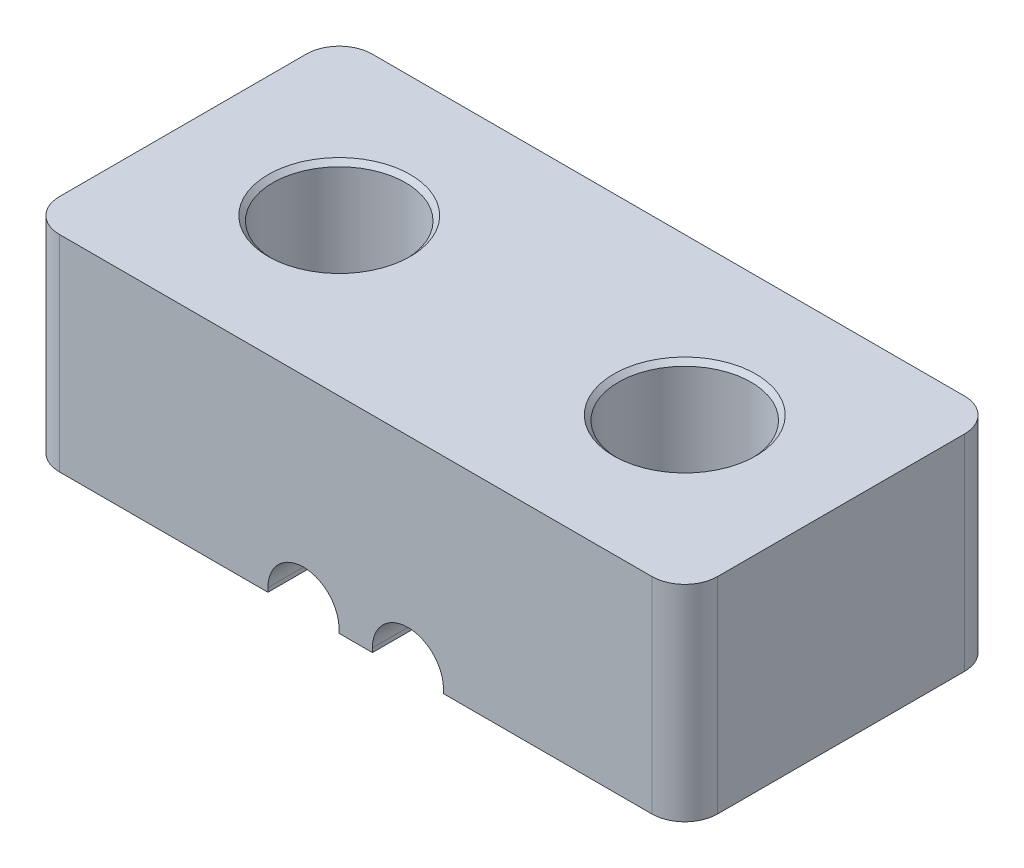
ISO-10303-21;
HEADER;
FILE_DESCRIPTION(('STEP AP214'),'2;1');
FILE_NAME('part.step','',(''),(''),'','','');
FILE_SCHEMA(('AUTOMOTIVE_DESIGN { 1 0 10303 214 1 1 1 1 }'));
ENDSEC;
DATA;
#1=APPLICATION_CONTEXT('core data for automotive mechanical design processes');
#2=APPLICATION_PROTOCOL_DEFINITION('international standard','automotive_design',2000,#1);
#3=PRODUCT_CONTEXT('',#1,'mechanical');
#4=PRODUCT('Part','Part','',(#3));
#5=PRODUCT_RELATED_PRODUCT_CATEGORY('part','',(#4));
#6=PRODUCT_DEFINITION_FORMATION('','',#4);
#7=PRODUCT_DEFINITION_CONTEXT('part definition',#1,'design');
#8=PRODUCT_DEFINITION('design','',#6,#7);
#9=PRODUCT_DEFINITION_SHAPE('','',#8);
#10=(LENGTH_UNIT() NAMED_UNIT(*) SI_UNIT(.MILLI.,.METRE.));
#11=(NAMED_UNIT(*) PLANE_ANGLE_UNIT() SI_UNIT($,.RADIAN.));
#12=(NAMED_UNIT(*) SI_UNIT($,.STERADIAN.) SOLID_ANGLE_UNIT());
#13=UNCERTAINTY_MEASURE_WITH_UNIT(LENGTH_MEASURE(1.E-05),#10,'distance_accuracy_value','');
#14=(GEOMETRIC_REPRESENTATION_CONTEXT(3) GLOBAL_UNCERTAINTY_ASSIGNED_CONTEXT((#13)) GLOBAL_UNIT_ASSIGNED_CONTEXT((#10,
#11,#12)) REPRESENTATION_CONTEXT('',''));
#15=CARTESIAN_POINT('',(0.,0.,0.));
#16=DIRECTION('',(0.,0.,1.));
#17=DIRECTION('',(1.,0.,0.));
#18=AXIS2_PLACEMENT_3D('',#15,#16,#17);
#19=CARTESIAN_POINT('',(-4.,0.,1.9));
#20=DIRECTION('',(0.,1.,0.));
#21=DIRECTION('',(0.,0.,1.));
#22=AXIS2_PLACEMENT_3D('',#19,#20,#21);
#23=PLANE('',#22);
#24=DIRECTION('',(1.,0.,0.));
#25=VECTOR('',#24,1.);
#26=CARTESIAN_POINT('',(-4.,0.,1.9));
#27=LINE('',#26,#25);
#28=CARTESIAN_POINT('',(-0.2032,0.,1.9));
#29=VERTEX_POINT('',#28);
#30=CARTESIAN_POINT('',(0.2032,0.,1.9));
#31=VERTEX_POINT('',#30);
#32=EDGE_CURVE('E239',#29,#31,#27,.T.);
#33=ORIENTED_EDGE('',*,*,#32,.F.);
#34=DIRECTION('',(0.,0.,-1.));
#35=VECTOR('',#34,1.);
#36=CARTESIAN_POINT('',(-0.2032,0.,1.9));
#37=LINE('',#36,#35);
#38=CARTESIAN_POINT('',(-0.2032,0.,-1.9));
#39=VERTEX_POINT('',#38);
#40=EDGE_CURVE('E177',#29,#39,#37,.T.);
#41=ORIENTED_EDGE('',*,*,#40,.T.);
#42=DIRECTION('',(-1.,0.,0.));
#43=VECTOR('',#42,1.);
#44=CARTESIAN_POINT('',(-4.,0.,-1.9));
#45=LINE('',#44,#43);
#46=CARTESIAN_POINT('',(0.2032,0.,-1.9));
#47=VERTEX_POINT('',#46);
#48=EDGE_CURVE('E227',#47,#39,#45,.T.);
#49=ORIENTED_EDGE('',*,*,#48,.F.);
#50=DIRECTION('',(0.,0.,1.));
#51=VECTOR('',#50,1.);
#52=CARTESIAN_POINT('',(0.2032,0.,1.9));
#53=LINE('',#52,#51);
#54=EDGE_CURVE('E183',#47,#31,#53,.T.);
#55=ORIENTED_EDGE('',*,*,#54,.T.);
#56=EDGE_LOOP('',(#33,#41,#49,#55));
#57=FACE_BOUND('',#56,.T.);
#58=ADVANCED_FACE('F34',(#57),#23,.F.);
#59=CARTESIAN_POINT('',(2.1,0.,0.));
#60=DIRECTION('',(0.,1.,0.));
#61=DIRECTION('',(0.,0.,1.));
#62=AXIS2_PLACEMENT_3D('',#59,#60,#61);
#63=CIRCLE('',#62,0.863599999999999);
#64=CARTESIAN_POINT('',(2.1,0.,0.863599999999999));
#65=VERTEX_POINT('',#64);
#66=EDGE_CURVE('E286',#65,#65,#63,.T.);
#67=ORIENTED_EDGE('',*,*,#66,.T.);
#68=EDGE_LOOP('',(#67));
#69=FACE_BOUND('',#68,.T.);
#70=DIRECTION('',(0.,0.,-1.));
#71=VECTOR('',#70,1.);
#72=CARTESIAN_POINT('',(4.,0.,-1.9));
#73=LINE('',#72,#71);
#74=CARTESIAN_POINT('',(4.,0.,1.5));
#75=VERTEX_POINT('',#74);
#76=CARTESIAN_POINT('',(4.,0.,-1.5));
#77=VERTEX_POINT('',#76);
#78=EDGE_CURVE('E235',#75,#77,#73,.T.);
#79=ORIENTED_EDGE('',*,*,#78,.F.);
#80=CARTESIAN_POINT('',(3.6,0.,1.5));
#81=DIRECTION('',(0.,1.,0.));
#82=DIRECTION('',(0.,0.,1.));
#83=AXIS2_PLACEMENT_3D('',#80,#81,#82);
#84=CIRCLE('',#83,0.4);
#85=CARTESIAN_POINT('',(3.6,0.,1.9));
#86=VERTEX_POINT('',#85);
#87=EDGE_CURVE('E214',#75,#86,#84,.F.);
#88=ORIENTED_EDGE('',*,*,#87,.T.);
#89=CARTESIAN_POINT('',(1.0668,0.,1.9));
#90=VERTEX_POINT('',#89);
#91=EDGE_CURVE('E241',#90,#86,#27,.T.);
#92=ORIENTED_EDGE('',*,*,#91,.F.);
#93=DIRECTION('',(0.,0.,-1.));
#94=VECTOR('',#93,1.);
#95=CARTESIAN_POINT('',(1.0668,0.,1.9));
#96=LINE('',#95,#94);
#97=CARTESIAN_POINT('',(1.0668,0.,-1.9));
#98=VERTEX_POINT('',#97);
#99=EDGE_CURVE('E225',#90,#98,#96,.T.);
#100=ORIENTED_EDGE('',*,*,#99,.T.);
#101=CARTESIAN_POINT('',(3.6,0.,-1.9));
#102=VERTEX_POINT('',#101);
#103=EDGE_CURVE('E217',#102,#98,#45,.T.);
#104=ORIENTED_EDGE('',*,*,#103,.F.);
#105=CARTESIAN_POINT('',(3.6,0.,-1.5));
#106=DIRECTION('',(0.,1.,0.));
#107=DIRECTION('',(0.,0.,1.));
#108=AXIS2_PLACEMENT_3D('',#105,#106,#107);
#109=CIRCLE('',#108,0.4);
#110=EDGE_CURVE('E49',#102,#77,#109,.F.);
#111=ORIENTED_EDGE('',*,*,#110,.T.);
#112=EDGE_LOOP('',(#79,#88,#92,#100,#104,#111));
#113=FACE_BOUND('',#112,.T.);
#114=ADVANCED_FACE('F223',(#69,#113),#23,.F.);
#115=CARTESIAN_POINT('',(-4.,2.5,-1.9));
#116=DIRECTION('',(1.,0.,0.));
#117=DIRECTION('',(0.,0.,-1.));
#118=AXIS2_PLACEMENT_3D('',#115,#116,#117);
#119=PLANE('',#118);
#120=DIRECTION('',(0.,0.,1.));
#121=VECTOR('',#120,1.);
#122=CARTESIAN_POINT('',(-4.,0.,-1.9));
#123=LINE('',#122,#121);
#124=CARTESIAN_POINT('',(-4.,0.,-1.5));
#125=VERTEX_POINT('',#124);
#126=CARTESIAN_POINT('',(-4.,0.,1.5));
#127=VERTEX_POINT('',#126);
#128=EDGE_CURVE('E243',#125,#127,#123,.T.);
#129=ORIENTED_EDGE('',*,*,#128,.T.);
#130=DIRECTION('',(0.,-1.,0.));
#131=VECTOR('',#130,1.);
#132=CARTESIAN_POINT('',(-4.,2.5,1.5));
#133=LINE('',#132,#131);
#134=CARTESIAN_POINT('',(-4.,2.5,1.5));
#135=VERTEX_POINT('',#134);
#136=EDGE_CURVE('E198',#127,#135,#133,.F.);
#137=ORIENTED_EDGE('',*,*,#136,.T.);
#138=DIRECTION('',(0.,0.,1.));
#139=VECTOR('',#138,1.);
#140=CARTESIAN_POINT('',(-4.,2.5,-1.9));
#141=LINE('',#140,#139);
#142=CARTESIAN_POINT('',(-4.,2.5,-1.5));
#143=VERTEX_POINT('',#142);
#144=EDGE_CURVE('E226',#143,#135,#141,.T.);
#145=ORIENTED_EDGE('',*,*,#144,.F.);
#146=DIRECTION('',(0.,-1.,0.));
#147=VECTOR('',#146,1.);
#148=CARTESIAN_POINT('',(-4.,2.5,-1.5));
#149=LINE('',#148,#147);
#150=EDGE_CURVE('E195',#143,#125,#149,.T.);
#151=ORIENTED_EDGE('',*,*,#150,.T.);
#152=EDGE_LOOP('',(#129,#137,#145,#151));
#153=FACE_BOUND('',#152,.T.);
#154=ADVANCED_FACE('F361',(#153),#119,.F.);
#155=CARTESIAN_POINT('',(-4.,2.5,1.9));
#156=DIRECTION('',(0.,0.,-1.));
#157=DIRECTION('',(-1.,0.,0.));
#158=AXIS2_PLACEMENT_3D('',#155,#156,#157);
#159=PLANE('',#158);
#160=DIRECTION('',(1.,0.,0.));
#161=VECTOR('',#160,1.);
#162=CARTESIAN_POINT('',(-4.,2.5,1.9));
#163=LINE('',#162,#161);
#164=CARTESIAN_POINT('',(-3.6,2.5,1.9));
#165=VERTEX_POINT('',#164);
#166=CARTESIAN_POINT('',(3.6,2.5,1.9));
#167=VERTEX_POINT('',#166);
#168=EDGE_CURVE('E231',#165,#167,#163,.T.);
#169=ORIENTED_EDGE('',*,*,#168,.F.);
#170=DIRECTION('',(0.,-1.,0.));
#171=VECTOR('',#170,1.);
#172=CARTESIAN_POINT('',(-3.6,2.5,1.9));
#173=LINE('',#172,#171);
#174=CARTESIAN_POINT('',(-3.6,0.,1.9));
#175=VERTEX_POINT('',#174);
#176=EDGE_CURVE('E188',#165,#175,#173,.T.);
#177=ORIENTED_EDGE('',*,*,#176,.T.);
#178=CARTESIAN_POINT('',(-1.0668,0.,1.9));
#179=VERTEX_POINT('',#178);
#180=EDGE_CURVE('E237',#175,#179,#27,.T.);
#181=ORIENTED_EDGE('',*,*,#180,.T.);
#182=DIRECTION('',(0.,1.,0.));
#183=VECTOR('',#182,1.);
#184=CARTESIAN_POINT('',(-1.0668,2.5,1.9));
#185=LINE('',#184,#183);
#186=CARTESIAN_POINT('',(-1.0668,0.0500000000000002,1.9));
#187=VERTEX_POINT('',#186);
#188=EDGE_CURVE('E159',#179,#187,#185,.T.);
#189=ORIENTED_EDGE('',*,*,#188,.T.);
#190=CARTESIAN_POINT('',(-0.635,0.0500000000000001,1.9));
#191=DIRECTION('',(0.,0.,-1.));
#192=DIRECTION('',(-1.,0.,0.));
#193=AXIS2_PLACEMENT_3D('',#190,#191,#192);
#194=CIRCLE('',#193,0.4318);
#195=CARTESIAN_POINT('',(-0.2032,0.0500000000000001,1.9));
#196=VERTEX_POINT('',#195);
#197=EDGE_CURVE('E168',#187,#196,#194,.T.);
#198=ORIENTED_EDGE('',*,*,#197,.T.);
#199=DIRECTION('',(0.,-1.,0.));
#200=VECTOR('',#199,1.);
#201=CARTESIAN_POINT('',(-0.2032,2.5,1.9));
#202=LINE('',#201,#200);
#203=EDGE_CURVE('E256',#196,#29,#202,.T.);
#204=ORIENTED_EDGE('',*,*,#203,.T.);
#205=ORIENTED_EDGE('',*,*,#32,.T.);
#206=DIRECTION('',(0.,1.,0.));
#207=VECTOR('',#206,1.);
#208=CARTESIAN_POINT('',(0.2032,2.5,1.9));
#209=LINE('',#208,#207);
#210=CARTESIAN_POINT('',(0.2032,0.0500000000000001,1.9));
#211=VERTEX_POINT('',#210);
#212=EDGE_CURVE('E260',#31,#211,#209,.T.);
#213=ORIENTED_EDGE('',*,*,#212,.T.);
#214=CARTESIAN_POINT('',(0.635,0.0500000000000001,1.9));
#215=DIRECTION('',(0.,0.,-1.));
#216=DIRECTION('',(-1.,0.,0.));
#217=AXIS2_PLACEMENT_3D('',#214,#215,#216);
#218=CIRCLE('',#217,0.4318);
#219=CARTESIAN_POINT('',(1.0668,0.0500000000000002,1.9));
#220=VERTEX_POINT('',#219);
#221=EDGE_CURVE('E253',#211,#220,#218,.T.);
#222=ORIENTED_EDGE('',*,*,#221,.T.);
#223=DIRECTION('',(0.,-1.,0.));
#224=VECTOR('',#223,1.);
#225=CARTESIAN_POINT('',(1.0668,2.5,1.9));
#226=LINE('',#225,#224);
#227=EDGE_CURVE('E266',#220,#90,#226,.T.);
#228=ORIENTED_EDGE('',*,*,#227,.T.);
#229=ORIENTED_EDGE('',*,*,#91,.T.);
#230=DIRECTION('',(0.,-1.,0.));
#231=VECTOR('',#230,1.);
#232=CARTESIAN_POINT('',(3.6,2.5,1.9));
#233=LINE('',#232,#231);
#234=EDGE_CURVE('E180',#86,#167,#233,.F.);
#235=ORIENTED_EDGE('',*,*,#234,.T.);
#236=EDGE_LOOP('',(#169,#177,#181,#189,#198,#204,#205,#213,#222,#228,#229,#235));
#237=FACE_BOUND('',#236,.T.);
#238=ADVANCED_FACE('F342',(#237),#159,.F.);
#239=CARTESIAN_POINT('',(4.,2.5,-1.9));
#240=DIRECTION('',(-1.,0.,0.));
#241=DIRECTION('',(0.,0.,1.));
#242=AXIS2_PLACEMENT_3D('',#239,#240,#241);
#243=PLANE('',#242);
#244=DIRECTION('',(0.,0.,-1.));
#245=VECTOR('',#244,1.);
#246=CARTESIAN_POINT('',(4.,2.5,-1.9));
#247=LINE('',#246,#245);
#248=CARTESIAN_POINT('',(4.,2.5,1.5));
#249=VERTEX_POINT('',#248);
#250=CARTESIAN_POINT('',(4.,2.5,-1.5));
#251=VERTEX_POINT('',#250);
#252=EDGE_CURVE('E247',#249,#251,#247,.T.);
#253=ORIENTED_EDGE('',*,*,#252,.F.);
#254=DIRECTION('',(0.,-1.,0.));
#255=VECTOR('',#254,1.);
#256=CARTESIAN_POINT('',(4.,2.5,1.5));
#257=LINE('',#256,#255);
#258=EDGE_CURVE('E210',#249,#75,#257,.T.);
#259=ORIENTED_EDGE('',*,*,#258,.T.);
#260=ORIENTED_EDGE('',*,*,#78,.T.);
#261=DIRECTION('',(0.,-1.,0.));
#262=VECTOR('',#261,1.);
#263=CARTESIAN_POINT('',(4.,2.5,-1.5));
#264=LINE('',#263,#262);
#265=EDGE_CURVE('E208',#77,#251,#264,.F.);
#266=ORIENTED_EDGE('',*,*,#265,.T.);
#267=EDGE_LOOP('',(#253,#259,#260,#266));
#268=FACE_BOUND('',#267,.T.);
#269=ADVANCED_FACE('F358',(#268),#243,.F.);
#270=CARTESIAN_POINT('',(-4.,2.5,-1.9));
#271=DIRECTION('',(0.,0.,1.));
#272=DIRECTION('',(1.,0.,0.));
#273=AXIS2_PLACEMENT_3D('',#270,#271,#272);
#274=PLANE('',#273);
#275=CARTESIAN_POINT('',(-1.0668,0.,-1.9));
#276=VERTEX_POINT('',#275);
#277=CARTESIAN_POINT('',(-3.6,0.,-1.9));
#278=VERTEX_POINT('',#277);
#279=EDGE_CURVE('E229',#276,#278,#45,.T.);
#280=ORIENTED_EDGE('',*,*,#279,.T.);
#281=DIRECTION('',(0.,-1.,0.));
#282=VECTOR('',#281,1.);
#283=CARTESIAN_POINT('',(-3.6,2.5,-1.9));
#284=LINE('',#283,#282);
#285=CARTESIAN_POINT('',(-3.6,2.5,-1.9));
#286=VERTEX_POINT('',#285);
#287=EDGE_CURVE('E11',#278,#286,#284,.F.);
#288=ORIENTED_EDGE('',*,*,#287,.T.);
#289=DIRECTION('',(-1.,0.,0.));
#290=VECTOR('',#289,1.);
#291=CARTESIAN_POINT('',(-4.,2.5,-1.9));
#292=LINE('',#291,#290);
#293=CARTESIAN_POINT('',(3.6,2.5,-1.9));
#294=VERTEX_POINT('',#293);
#295=EDGE_CURVE('E220',#294,#286,#292,.T.);
#296=ORIENTED_EDGE('',*,*,#295,.F.);
#297=DIRECTION('',(0.,-1.,0.));
#298=VECTOR('',#297,1.);
#299=CARTESIAN_POINT('',(3.6,2.5,-1.9));
#300=LINE('',#299,#298);
#301=EDGE_CURVE('E42',#294,#102,#300,.T.);
#302=ORIENTED_EDGE('',*,*,#301,.T.);
#303=ORIENTED_EDGE('',*,*,#103,.T.);
#304=DIRECTION('',(0.,1.,0.));
#305=VECTOR('',#304,1.);
#306=CARTESIAN_POINT('',(1.0668,2.5,-1.9));
#307=LINE('',#306,#305);
#308=CARTESIAN_POINT('',(1.0668,0.0500000000000002,-1.9));
#309=VERTEX_POINT('',#308);
#310=EDGE_CURVE('E269',#98,#309,#307,.T.);
#311=ORIENTED_EDGE('',*,*,#310,.T.);
#312=CARTESIAN_POINT('',(0.635,0.0500000000000001,-1.9));
#313=DIRECTION('',(0.,0.,1.));
#314=DIRECTION('',(1.,0.,0.));
#315=AXIS2_PLACEMENT_3D('',#312,#313,#314);
#316=CIRCLE('',#315,0.4318);
#317=CARTESIAN_POINT('',(0.2032,0.0500000000000001,-1.9));
#318=VERTEX_POINT('',#317);
#319=EDGE_CURVE('E176',#309,#318,#316,.T.);
#320=ORIENTED_EDGE('',*,*,#319,.T.);
#321=DIRECTION('',(0.,-1.,0.));
#322=VECTOR('',#321,1.);
#323=CARTESIAN_POINT('',(0.2032,2.5,-1.9));
#324=LINE('',#323,#322);
#325=EDGE_CURVE('E263',#318,#47,#324,.T.);
#326=ORIENTED_EDGE('',*,*,#325,.T.);
#327=ORIENTED_EDGE('',*,*,#48,.T.);
#328=DIRECTION('',(0.,1.,0.));
#329=VECTOR('',#328,1.);
#330=CARTESIAN_POINT('',(-0.2032,2.5,-1.9));
#331=LINE('',#330,#329);
#332=CARTESIAN_POINT('',(-0.2032,0.0500000000000001,-1.9));
#333=VERTEX_POINT('',#332);
#334=EDGE_CURVE('E175',#39,#333,#331,.T.);
#335=ORIENTED_EDGE('',*,*,#334,.T.);
#336=CARTESIAN_POINT('',(-0.635,0.0500000000000001,-1.9));
#337=DIRECTION('',(0.,0.,1.));
#338=DIRECTION('',(1.,0.,0.));
#339=AXIS2_PLACEMENT_3D('',#336,#337,#338);
#340=CIRCLE('',#339,0.4318);
#341=CARTESIAN_POINT('',(-1.0668,0.0500000000000002,-1.9));
#342=VERTEX_POINT('',#341);
#343=EDGE_CURVE('E165',#333,#342,#340,.T.);
#344=ORIENTED_EDGE('',*,*,#343,.T.);
#345=DIRECTION('',(0.,-1.,0.));
#346=VECTOR('',#345,1.);
#347=CARTESIAN_POINT('',(-1.0668,2.5,-1.9));
#348=LINE('',#347,#346);
#349=EDGE_CURVE('E147',#342,#276,#348,.T.);
#350=ORIENTED_EDGE('',*,*,#349,.T.);
#351=EDGE_LOOP('',(#280,#288,#296,#302,#303,#311,#320,#326,#327,#335,#344,#350));
#352=FACE_BOUND('',#351,.T.);
#353=ADVANCED_FACE('F173',(#352),#274,.F.);
#354=CARTESIAN_POINT('',(-4.,2.5,1.9));
#355=DIRECTION('',(0.,1.,0.));
#356=DIRECTION('',(0.,0.,1.));
#357=AXIS2_PLACEMENT_3D('',#354,#355,#356);
#358=PLANE('',#357);
#359=CARTESIAN_POINT('',(-2.1,2.5,0.));
#360=DIRECTION('',(0.,1.,0.));
#361=DIRECTION('',(0.,0.,1.));
#362=AXIS2_PLACEMENT_3D('',#359,#360,#361);
#363=CIRCLE('',#362,0.8636);
#364=CARTESIAN_POINT('',(-2.1,2.5,0.8636));
#365=VERTEX_POINT('',#364);
#366=EDGE_CURVE('E295',#365,#365,#363,.T.);
#367=ORIENTED_EDGE('',*,*,#366,.F.);
#368=EDGE_LOOP('',(#367));
#369=FACE_BOUND('',#368,.T.);
#370=CARTESIAN_POINT('',(2.1,2.5,0.));
#371=DIRECTION('',(0.,1.,0.));
#372=DIRECTION('',(0.,0.,1.));
#373=AXIS2_PLACEMENT_3D('',#370,#371,#372);
#374=CIRCLE('',#373,0.8636);
#375=CARTESIAN_POINT('',(2.1,2.5,0.8636));
#376=VERTEX_POINT('',#375);
#377=EDGE_CURVE('E283',#376,#376,#374,.T.);
#378=ORIENTED_EDGE('',*,*,#377,.F.);
#379=EDGE_LOOP('',(#378));
#380=FACE_BOUND('',#379,.T.);
#381=ORIENTED_EDGE('',*,*,#144,.T.);
#382=CARTESIAN_POINT('',(-3.6,2.5,1.5));
#383=DIRECTION('',(0.,1.,0.));
#384=DIRECTION('',(0.,0.,1.));
#385=AXIS2_PLACEMENT_3D('',#382,#383,#384);
#386=CIRCLE('',#385,0.4);
#387=EDGE_CURVE('E206',#135,#165,#386,.T.);
#388=ORIENTED_EDGE('',*,*,#387,.T.);
#389=ORIENTED_EDGE('',*,*,#168,.T.);
#390=CARTESIAN_POINT('',(3.6,2.5,1.5));
#391=DIRECTION('',(0.,1.,0.));
#392=DIRECTION('',(0.,0.,1.));
#393=AXIS2_PLACEMENT_3D('',#390,#391,#392);
#394=CIRCLE('',#393,0.4);
#395=EDGE_CURVE('E204',#167,#249,#394,.T.);
#396=ORIENTED_EDGE('',*,*,#395,.T.);
#397=ORIENTED_EDGE('',*,*,#252,.T.);
#398=CARTESIAN_POINT('',(3.6,2.5,-1.5));
#399=DIRECTION('',(0.,1.,0.));
#400=DIRECTION('',(0.,0.,1.));
#401=AXIS2_PLACEMENT_3D('',#398,#399,#400);
#402=CIRCLE('',#401,0.4);
#403=EDGE_CURVE('E200',#251,#294,#402,.T.);
#404=ORIENTED_EDGE('',*,*,#403,.T.);
#405=ORIENTED_EDGE('',*,*,#295,.T.);
#406=CARTESIAN_POINT('',(-3.6,2.5,-1.5));
#407=DIRECTION('',(0.,1.,0.));
#408=DIRECTION('',(0.,0.,1.));
#409=AXIS2_PLACEMENT_3D('',#406,#407,#408);
#410=CIRCLE('',#409,0.4);
#411=EDGE_CURVE('E202',#286,#143,#410,.T.);
#412=ORIENTED_EDGE('',*,*,#411,.T.);
#413=EDGE_LOOP('',(#381,#388,#389,#396,#397,#404,#405,#412));
#414=FACE_BOUND('',#413,.T.);
#415=ADVANCED_FACE('F325',(#369,#380,#414),#358,.T.);
#416=CARTESIAN_POINT('',(-2.1,0.,0.));
#417=DIRECTION('',(0.,1.,0.));
#418=DIRECTION('',(0.,0.,1.));
#419=AXIS2_PLACEMENT_3D('',#416,#417,#418);
#420=CIRCLE('',#419,0.863599999999999);
#421=CARTESIAN_POINT('',(-2.1,0.,0.863599999999999));
#422=VERTEX_POINT('',#421);
#423=EDGE_CURVE('E298',#422,#422,#420,.T.);
#424=ORIENTED_EDGE('',*,*,#423,.T.);
#425=EDGE_LOOP('',(#424));
#426=FACE_BOUND('',#425,.T.);
#427=ORIENTED_EDGE('',*,*,#180,.F.);
#428=CARTESIAN_POINT('',(-3.6,0.,1.5));
#429=DIRECTION('',(0.,1.,0.));
#430=DIRECTION('',(0.,0.,1.));
#431=AXIS2_PLACEMENT_3D('',#428,#429,#430);
#432=CIRCLE('',#431,0.4);
#433=EDGE_CURVE('E193',#175,#127,#432,.F.);
#434=ORIENTED_EDGE('',*,*,#433,.T.);
#435=ORIENTED_EDGE('',*,*,#128,.F.);
#436=CARTESIAN_POINT('',(-3.6,0.,-1.5));
#437=DIRECTION('',(0.,1.,0.));
#438=DIRECTION('',(0.,0.,1.));
#439=AXIS2_PLACEMENT_3D('',#436,#437,#438);
#440=CIRCLE('',#439,0.4);
#441=EDGE_CURVE('E191',#125,#278,#440,.F.);
#442=ORIENTED_EDGE('',*,*,#441,.T.);
#443=ORIENTED_EDGE('',*,*,#279,.F.);
#444=DIRECTION('',(0.,0.,1.));
#445=VECTOR('',#444,1.);
#446=CARTESIAN_POINT('',(-1.0668,0.,1.9));
#447=LINE('',#446,#445);
#448=EDGE_CURVE('E154',#276,#179,#447,.T.);
#449=ORIENTED_EDGE('',*,*,#448,.T.);
#450=EDGE_LOOP('',(#427,#434,#435,#442,#443,#449));
#451=FACE_BOUND('',#450,.T.);
#452=ADVANCED_FACE('F302',(#426,#451),#23,.F.);
#453=CARTESIAN_POINT('',(-0.2032,-2.49,-3.));
#454=DIRECTION('',(1.,0.,0.));
#455=DIRECTION('',(0.,0.,-1.));
#456=AXIS2_PLACEMENT_3D('',#453,#454,#455);
#457=PLANE('',#456);
#458=DIRECTION('',(0.,0.,1.));
#459=VECTOR('',#458,1.);
#460=CARTESIAN_POINT('',(-0.2032,0.0500000000000001,-3.));
#461=LINE('',#460,#459);
#462=EDGE_CURVE('E160',#333,#196,#461,.T.);
#463=ORIENTED_EDGE('',*,*,#462,.F.);
#464=ORIENTED_EDGE('',*,*,#334,.F.);
#465=ORIENTED_EDGE('',*,*,#40,.F.);
#466=ORIENTED_EDGE('',*,*,#203,.F.);
#467=EDGE_LOOP('',(#463,#464,#465,#466));
#468=FACE_BOUND('',#467,.T.);
#469=ADVANCED_FACE('F377',(#468),#457,.F.);
#470=CARTESIAN_POINT('',(-1.0668,0.0500000000000002,-3.));
#471=DIRECTION('',(-1.,0.,0.));
#472=DIRECTION('',(0.,-1.,0.));
#473=AXIS2_PLACEMENT_3D('',#470,#471,#472);
#474=PLANE('',#473);
#475=ORIENTED_EDGE('',*,*,#448,.F.);
#476=ORIENTED_EDGE('',*,*,#349,.F.);
#477=DIRECTION('',(0.,0.,1.));
#478=VECTOR('',#477,1.);
#479=CARTESIAN_POINT('',(-1.0668,0.0500000000000002,-3.));
#480=LINE('',#479,#478);
#481=EDGE_CURVE('E151',#342,#187,#480,.T.);
#482=ORIENTED_EDGE('',*,*,#481,.T.);
#483=ORIENTED_EDGE('',*,*,#188,.F.);
#484=EDGE_LOOP('',(#475,#476,#482,#483));
#485=FACE_BOUND('',#484,.T.);
#486=ADVANCED_FACE('F149',(#485),#474,.F.);
#487=CARTESIAN_POINT('',(-0.635,0.0500000000000001,-3.));
#488=DIRECTION('',(0.,0.,1.));
#489=DIRECTION('',(1.,0.,0.));
#490=AXIS2_PLACEMENT_3D('',#487,#488,#489);
#491=CYLINDRICAL_SURFACE('',#490,0.4318);
#492=ORIENTED_EDGE('',*,*,#481,.F.);
#493=ORIENTED_EDGE('',*,*,#343,.F.);
#494=ORIENTED_EDGE('',*,*,#462,.T.);
#495=ORIENTED_EDGE('',*,*,#197,.F.);
#496=EDGE_LOOP('',(#492,#493,#494,#495));
#497=FACE_BOUND('',#496,.T.);
#498=ADVANCED_FACE('F163',(#497),#491,.F.);
#499=CARTESIAN_POINT('',(0.635,0.0500000000000001,-3.));
#500=DIRECTION('',(0.,0.,1.));
#501=DIRECTION('',(1.,0.,0.));
#502=AXIS2_PLACEMENT_3D('',#499,#500,#501);
#503=CYLINDRICAL_SURFACE('',#502,0.4318);
#504=DIRECTION('',(0.,0.,1.));
#505=VECTOR('',#504,1.);
#506=CARTESIAN_POINT('',(0.2032,0.0500000000000001,-3.));
#507=LINE('',#506,#505);
#508=EDGE_CURVE('E274',#318,#211,#507,.T.);
#509=ORIENTED_EDGE('',*,*,#508,.F.);
#510=ORIENTED_EDGE('',*,*,#319,.F.);
#511=DIRECTION('',(0.,0.,1.));
#512=VECTOR('',#511,1.);
#513=CARTESIAN_POINT('',(1.0668,0.0500000000000002,-3.));
#514=LINE('',#513,#512);
#515=EDGE_CURVE('E169',#309,#220,#514,.T.);
#516=ORIENTED_EDGE('',*,*,#515,.T.);
#517=ORIENTED_EDGE('',*,*,#221,.F.);
#518=EDGE_LOOP('',(#509,#510,#516,#517));
#519=FACE_BOUND('',#518,.T.);
#520=ADVANCED_FACE('F395',(#519),#503,.F.);
#521=CARTESIAN_POINT('',(0.2032,-2.49,-3.));
#522=DIRECTION('',(-1.,0.,0.));
#523=DIRECTION('',(0.,0.,1.));
#524=AXIS2_PLACEMENT_3D('',#521,#522,#523);
#525=PLANE('',#524);
#526=ORIENTED_EDGE('',*,*,#54,.F.);
#527=ORIENTED_EDGE('',*,*,#325,.F.);
#528=ORIENTED_EDGE('',*,*,#508,.T.);
#529=ORIENTED_EDGE('',*,*,#212,.F.);
#530=EDGE_LOOP('',(#526,#527,#528,#529));
#531=FACE_BOUND('',#530,.T.);
#532=ADVANCED_FACE('F391',(#531),#525,.F.);
#533=CARTESIAN_POINT('',(1.0668,0.0500000000000002,-3.));
#534=DIRECTION('',(1.,0.,0.));
#535=DIRECTION('',(0.,1.,0.));
#536=AXIS2_PLACEMENT_3D('',#533,#534,#535);
#537=PLANE('',#536);
#538=ORIENTED_EDGE('',*,*,#515,.F.);
#539=ORIENTED_EDGE('',*,*,#310,.F.);
#540=ORIENTED_EDGE('',*,*,#99,.F.);
#541=ORIENTED_EDGE('',*,*,#227,.F.);
#542=EDGE_LOOP('',(#538,#539,#540,#541));
#543=FACE_BOUND('',#542,.T.);
#544=ADVANCED_FACE('F394',(#543),#537,.F.);
#545=CARTESIAN_POINT('',(2.1,0.057150000000001,0.));
#546=DIRECTION('',(0.,-1.,0.));
#547=DIRECTION('',(0.,0.,-1.));
#548=AXIS2_PLACEMENT_3D('',#545,#546,#547);
#549=CONICAL_SURFACE('',#548,0.806449999999999,0.785398163397437);
#550=ORIENTED_EDGE('',*,*,#66,.F.);
#551=EDGE_LOOP('',(#550));
#552=FACE_BOUND('',#551,.T.);
#553=CARTESIAN_POINT('',(2.1,0.057150000000001,0.));
#554=DIRECTION('',(0.,1.,0.));
#555=DIRECTION('',(0.,0.,1.));
#556=AXIS2_PLACEMENT_3D('',#553,#554,#555);
#557=CIRCLE('',#556,0.806449999999999);
#558=CARTESIAN_POINT('',(2.1,0.057150000000001,0.806449999999999));
#559=VERTEX_POINT('',#558);
#560=EDGE_CURVE('E170',#559,#559,#557,.T.);
#561=ORIENTED_EDGE('',*,*,#560,.T.);
#562=EDGE_LOOP('',(#561));
#563=FACE_BOUND('',#562,.T.);
#564=ADVANCED_FACE('F389',(#552,#563),#549,.F.);
#565=CARTESIAN_POINT('',(2.1,2.5,0.));
#566=DIRECTION('',(0.,1.,0.));
#567=DIRECTION('',(0.,0.,1.));
#568=AXIS2_PLACEMENT_3D('',#565,#566,#567);
#569=CYLINDRICAL_SURFACE('',#568,0.80645);
#570=ORIENTED_EDGE('',*,*,#560,.F.);
#571=EDGE_LOOP('',(#570));
#572=FACE_BOUND('',#571,.T.);
#573=CARTESIAN_POINT('',(2.1,2.44285,0.));
#574=DIRECTION('',(0.,1.,0.));
#575=DIRECTION('',(0.,0.,1.));
#576=AXIS2_PLACEMENT_3D('',#573,#574,#575);
#577=CIRCLE('',#576,0.80645);
#578=CARTESIAN_POINT('',(2.1,2.44285,0.80645));
#579=VERTEX_POINT('',#578);
#580=EDGE_CURVE('E280',#579,#579,#577,.T.);
#581=ORIENTED_EDGE('',*,*,#580,.T.);
#582=EDGE_LOOP('',(#581));
#583=FACE_BOUND('',#582,.T.);
#584=ADVANCED_FACE('F425',(#572,#583),#569,.F.);
#585=CARTESIAN_POINT('',(2.1,2.5,0.));
#586=DIRECTION('',(0.,1.,0.));
#587=DIRECTION('',(0.,0.,1.));
#588=AXIS2_PLACEMENT_3D('',#585,#586,#587);
#589=CONICAL_SURFACE('',#588,0.8636,0.785398163397452);
#590=ORIENTED_EDGE('',*,*,#580,.F.);
#591=EDGE_LOOP('',(#590));
#592=FACE_BOUND('',#591,.T.);
#593=ORIENTED_EDGE('',*,*,#377,.T.);
#594=EDGE_LOOP('',(#593));
#595=FACE_BOUND('',#594,.T.);
#596=ADVANCED_FACE('F309',(#592,#595),#589,.F.);
#597=CARTESIAN_POINT('',(-2.1,0.057150000000001,0.));
#598=DIRECTION('',(0.,-1.,0.));
#599=DIRECTION('',(0.,0.,-1.));
#600=AXIS2_PLACEMENT_3D('',#597,#598,#599);
#601=CONICAL_SURFACE('',#600,0.806449999999999,0.785398163397437);
#602=ORIENTED_EDGE('',*,*,#423,.F.);
#603=EDGE_LOOP('',(#602));
#604=FACE_BOUND('',#603,.T.);
#605=CARTESIAN_POINT('',(-2.1,0.057150000000001,0.));
#606=DIRECTION('',(0.,1.,0.));
#607=DIRECTION('',(0.,0.,1.));
#608=AXIS2_PLACEMENT_3D('',#605,#606,#607);
#609=CIRCLE('',#608,0.806449999999999);
#610=CARTESIAN_POINT('',(-2.1,0.057150000000001,0.806449999999999));
#611=VERTEX_POINT('',#610);
#612=EDGE_CURVE('E289',#611,#611,#609,.T.);
#613=ORIENTED_EDGE('',*,*,#612,.T.);
#614=EDGE_LOOP('',(#613));
#615=FACE_BOUND('',#614,.T.);
#616=ADVANCED_FACE('F305',(#604,#615),#601,.F.);
#617=CARTESIAN_POINT('',(-2.1,2.5,0.));
#618=DIRECTION('',(0.,1.,0.));
#619=DIRECTION('',(0.,0.,1.));
#620=AXIS2_PLACEMENT_3D('',#617,#618,#619);
#621=CYLINDRICAL_SURFACE('',#620,0.80645);
#622=ORIENTED_EDGE('',*,*,#612,.F.);
#623=EDGE_LOOP('',(#622));
#624=FACE_BOUND('',#623,.T.);
#625=CARTESIAN_POINT('',(-2.1,2.44285,0.));
#626=DIRECTION('',(0.,1.,0.));
#627=DIRECTION('',(0.,0.,1.));
#628=AXIS2_PLACEMENT_3D('',#625,#626,#627);
#629=CIRCLE('',#628,0.80645);
#630=CARTESIAN_POINT('',(-2.1,2.44285,0.80645));
#631=VERTEX_POINT('',#630);
#632=EDGE_CURVE('E292',#631,#631,#629,.T.);
#633=ORIENTED_EDGE('',*,*,#632,.T.);
#634=EDGE_LOOP('',(#633));
#635=FACE_BOUND('',#634,.T.);
#636=ADVANCED_FACE('F308',(#624,#635),#621,.F.);
#637=CARTESIAN_POINT('',(-2.1,2.5,0.));
#638=DIRECTION('',(0.,1.,0.));
#639=DIRECTION('',(0.,0.,1.));
#640=AXIS2_PLACEMENT_3D('',#637,#638,#639);
#641=CONICAL_SURFACE('',#640,0.8636,0.785398163397452);
#642=ORIENTED_EDGE('',*,*,#632,.F.);
#643=EDGE_LOOP('',(#642));
#644=FACE_BOUND('',#643,.T.);
#645=ORIENTED_EDGE('',*,*,#366,.T.);
#646=EDGE_LOOP('',(#645));
#647=FACE_BOUND('',#646,.T.);
#648=ADVANCED_FACE('F315',(#644,#647),#641,.F.);
#649=CARTESIAN_POINT('',(-3.6,2.5,1.5));
#650=DIRECTION('',(0.,-1.,0.));
#651=DIRECTION('',(0.,0.,-1.));
#652=AXIS2_PLACEMENT_3D('',#649,#650,#651);
#653=CYLINDRICAL_SURFACE('',#652,0.4);
#654=ORIENTED_EDGE('',*,*,#387,.F.);
#655=ORIENTED_EDGE('',*,*,#136,.F.);
#656=ORIENTED_EDGE('',*,*,#433,.F.);
#657=ORIENTED_EDGE('',*,*,#176,.F.);
#658=EDGE_LOOP('',(#654,#655,#656,#657));
#659=FACE_BOUND('',#658,.T.);
#660=ADVANCED_FACE('F321',(#659),#653,.T.);
#661=CARTESIAN_POINT('',(3.6,2.5,1.5));
#662=DIRECTION('',(0.,-1.,0.));
#663=DIRECTION('',(0.,0.,-1.));
#664=AXIS2_PLACEMENT_3D('',#661,#662,#663);
#665=CYLINDRICAL_SURFACE('',#664,0.4);
#666=ORIENTED_EDGE('',*,*,#395,.F.);
#667=ORIENTED_EDGE('',*,*,#234,.F.);
#668=ORIENTED_EDGE('',*,*,#87,.F.);
#669=ORIENTED_EDGE('',*,*,#258,.F.);
#670=EDGE_LOOP('',(#666,#667,#668,#669));
#671=FACE_BOUND('',#670,.T.);
#672=ADVANCED_FACE('F355',(#671),#665,.T.);
#673=CARTESIAN_POINT('',(-3.6,2.5,-1.5));
#674=DIRECTION('',(0.,-1.,0.));
#675=DIRECTION('',(0.,0.,-1.));
#676=AXIS2_PLACEMENT_3D('',#673,#674,#675);
#677=CYLINDRICAL_SURFACE('',#676,0.4);
#678=ORIENTED_EDGE('',*,*,#411,.F.);
#679=ORIENTED_EDGE('',*,*,#287,.F.);
#680=ORIENTED_EDGE('',*,*,#441,.F.);
#681=ORIENTED_EDGE('',*,*,#150,.F.);
#682=EDGE_LOOP('',(#678,#679,#680,#681));
#683=FACE_BOUND('',#682,.T.);
#684=ADVANCED_FACE('F360',(#683),#677,.T.);
#685=CARTESIAN_POINT('',(3.6,2.5,-1.5));
#686=DIRECTION('',(0.,-1.,0.));
#687=DIRECTION('',(0.,0.,-1.));
#688=AXIS2_PLACEMENT_3D('',#685,#686,#687);
#689=CYLINDRICAL_SURFACE('',#688,0.4);
#690=ORIENTED_EDGE('',*,*,#403,.F.);
#691=ORIENTED_EDGE('',*,*,#265,.F.);
#692=ORIENTED_EDGE('',*,*,#110,.F.);
#693=ORIENTED_EDGE('',*,*,#301,.F.);
#694=EDGE_LOOP('',(#690,#691,#692,#693));
#695=FACE_BOUND('',#694,.T.);
#696=ADVANCED_FACE('F36',(#695),#689,.T.);
#697=CLOSED_SHELL('',(#58,#114,#154,#238,#269,#353,#415,#452,#469,#486,#498,#520,#532,#544,#564,
#584,#596,#616,#636,#648,#660,#672,#684,#696));
#698=MANIFOLD_SOLID_BREP('B2',#697);
#699=ADVANCED_BREP_SHAPE_REPRESENTATION('',(#18,#698),#14);
#700=SHAPE_DEFINITION_REPRESENTATION(#9,#699);
ENDSEC;
END-ISO-10303-21;
